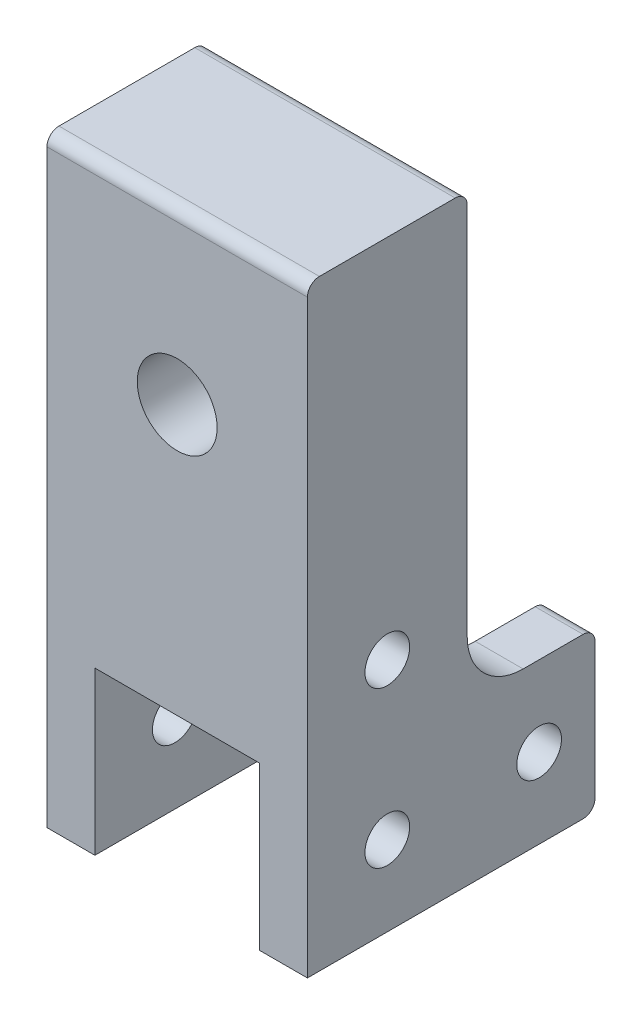
ISO-10303-21;
HEADER;
FILE_DESCRIPTION(('STEP AP214'),'2;1');
FILE_NAME('part.step','',(''),(''),'','','');
FILE_SCHEMA(('AUTOMOTIVE_DESIGN { 1 0 10303 214 1 1 1 1 }'));
ENDSEC;
DATA;
#1=APPLICATION_CONTEXT('core data for automotive mechanical design processes');
#2=APPLICATION_PROTOCOL_DEFINITION('international standard','automotive_design',2000,#1);
#3=PRODUCT_CONTEXT('',#1,'mechanical');
#4=PRODUCT('Part','Part','',(#3));
#5=PRODUCT_RELATED_PRODUCT_CATEGORY('part','',(#4));
#6=PRODUCT_DEFINITION_FORMATION('','',#4);
#7=PRODUCT_DEFINITION_CONTEXT('part definition',#1,'design');
#8=PRODUCT_DEFINITION('design','',#6,#7);
#9=PRODUCT_DEFINITION_SHAPE('','',#8);
#10=(LENGTH_UNIT() NAMED_UNIT(*) SI_UNIT(.MILLI.,.METRE.));
#11=(NAMED_UNIT(*) PLANE_ANGLE_UNIT() SI_UNIT($,.RADIAN.));
#12=(NAMED_UNIT(*) SI_UNIT($,.STERADIAN.) SOLID_ANGLE_UNIT());
#13=UNCERTAINTY_MEASURE_WITH_UNIT(LENGTH_MEASURE(1.E-05),#10,'distance_accuracy_value','');
#14=(GEOMETRIC_REPRESENTATION_CONTEXT(3) GLOBAL_UNCERTAINTY_ASSIGNED_CONTEXT((#13)) GLOBAL_UNIT_ASSIGNED_CONTEXT((#10,
#11,#12)) REPRESENTATION_CONTEXT('',''));
#15=CARTESIAN_POINT('',(0.,0.,0.));
#16=DIRECTION('',(0.,0.,1.));
#17=DIRECTION('',(1.,0.,0.));
#18=AXIS2_PLACEMENT_3D('',#15,#16,#17);
#19=CARTESIAN_POINT('',(-10.3,65.3,10.));
#20=DIRECTION('',(0.,0.,1.));
#21=DIRECTION('',(0.,-1.,0.));
#22=AXIS2_PLACEMENT_3D('',#19,#20,#21);
#23=PLANE('',#22);
#24=DIRECTION('',(1.,0.,0.));
#25=VECTOR('',#24,1.);
#26=CARTESIAN_POINT('',(-10.3,10.3,10.));
#27=LINE('',#26,#25);
#28=CARTESIAN_POINT('',(-10.3,10.3,10.));
#29=VERTEX_POINT('',#28);
#30=CARTESIAN_POINT('',(10.3,10.3,10.));
#31=VERTEX_POINT('',#30);
#32=EDGE_CURVE('E290',#29,#31,#27,.T.);
#33=ORIENTED_EDGE('',*,*,#32,.T.);
#34=DIRECTION('',(0.,-1.,0.));
#35=VECTOR('',#34,1.);
#36=CARTESIAN_POINT('',(10.3,17.,10.));
#37=LINE('',#36,#35);
#38=CARTESIAN_POINT('',(10.3,-10.,10.));
#39=VERTEX_POINT('',#38);
#40=EDGE_CURVE('E424',#31,#39,#37,.T.);
#41=ORIENTED_EDGE('',*,*,#40,.T.);
#42=DIRECTION('',(-1.,0.,0.));
#43=VECTOR('',#42,1.);
#44=CARTESIAN_POINT('',(-16.3,-10.,10.));
#45=LINE('',#44,#43);
#46=CARTESIAN_POINT('',(16.3,-10.,9.99999999999999));
#47=VERTEX_POINT('',#46);
#48=EDGE_CURVE('E193',#47,#39,#45,.T.);
#49=ORIENTED_EDGE('',*,*,#48,.F.);
#50=DIRECTION('',(0.,-1.,0.));
#51=VECTOR('',#50,1.);
#52=CARTESIAN_POINT('',(16.3,65.3,10.));
#53=LINE('',#52,#51);
#54=CARTESIAN_POINT('',(16.3,63.8,10.));
#55=VERTEX_POINT('',#54);
#56=EDGE_CURVE('E55',#55,#47,#53,.T.);
#57=ORIENTED_EDGE('',*,*,#56,.F.);
#58=DIRECTION('',(1.,0.,0.));
#59=VECTOR('',#58,1.);
#60=CARTESIAN_POINT('',(-10.3,63.8,10.));
#61=LINE('',#60,#59);
#62=CARTESIAN_POINT('',(-16.3,63.8,10.));
#63=VERTEX_POINT('',#62);
#64=EDGE_CURVE('E48',#55,#63,#61,.F.);
#65=ORIENTED_EDGE('',*,*,#64,.T.);
#66=DIRECTION('',(0.,-1.,0.));
#67=VECTOR('',#66,1.);
#68=CARTESIAN_POINT('',(-16.3,65.3,10.));
#69=LINE('',#68,#67);
#70=CARTESIAN_POINT('',(-16.3,-10.,10.));
#71=VERTEX_POINT('',#70);
#72=EDGE_CURVE('E178',#63,#71,#69,.T.);
#73=ORIENTED_EDGE('',*,*,#72,.T.);
#74=CARTESIAN_POINT('',(-10.3,-10.,10.));
#75=VERTEX_POINT('',#74);
#76=EDGE_CURVE('E181',#75,#71,#45,.T.);
#77=ORIENTED_EDGE('',*,*,#76,.F.);
#78=DIRECTION('',(0.,1.,0.));
#79=VECTOR('',#78,1.);
#80=CARTESIAN_POINT('',(-10.3,17.,10.));
#81=LINE('',#80,#79);
#82=EDGE_CURVE('E421',#75,#29,#81,.T.);
#83=ORIENTED_EDGE('',*,*,#82,.T.);
#84=EDGE_LOOP('',(#33,#41,#49,#57,#65,#73,#77,#83));
#85=FACE_BOUND('',#84,.T.);
#86=CARTESIAN_POINT('',(0.,44.,10.));
#87=DIRECTION('',(0.,0.,1.));
#88=DIRECTION('',(1.,0.,0.));
#89=AXIS2_PLACEMENT_3D('',#86,#87,#88);
#90=CIRCLE('',#89,5.);
#91=CARTESIAN_POINT('',(5.,44.,10.));
#92=VERTEX_POINT('',#91);
#93=EDGE_CURVE('E302',#92,#92,#90,.T.);
#94=ORIENTED_EDGE('',*,*,#93,.F.);
#95=EDGE_LOOP('',(#94));
#96=FACE_BOUND('',#95,.T.);
#97=ADVANCED_FACE('F39',(#85,#96),#23,.T.);
#98=CARTESIAN_POINT('',(-10.3,65.3,-9.99999999999998));
#99=DIRECTION('',(0.,1.,0.));
#100=DIRECTION('',(0.,0.,1.));
#101=AXIS2_PLACEMENT_3D('',#98,#99,#100);
#102=PLANE('',#101);
#103=DIRECTION('',(0.,0.,1.));
#104=VECTOR('',#103,1.);
#105=CARTESIAN_POINT('',(-16.3,65.3,10.));
#106=LINE('',#105,#104);
#107=CARTESIAN_POINT('',(-16.3,65.3,-8.49999999999998));
#108=VERTEX_POINT('',#107);
#109=CARTESIAN_POINT('',(-16.3,65.3,8.50000000000002));
#110=VERTEX_POINT('',#109);
#111=EDGE_CURVE('E187',#108,#110,#106,.T.);
#112=ORIENTED_EDGE('',*,*,#111,.T.);
#113=DIRECTION('',(1.,0.,0.));
#114=VECTOR('',#113,1.);
#115=CARTESIAN_POINT('',(-10.3,65.3,8.50000000000002));
#116=LINE('',#115,#114);
#117=CARTESIAN_POINT('',(16.3,65.3,8.50000000000002));
#118=VERTEX_POINT('',#117);
#119=EDGE_CURVE('E369',#110,#118,#116,.T.);
#120=ORIENTED_EDGE('',*,*,#119,.T.);
#121=DIRECTION('',(0.,0.,1.));
#122=VECTOR('',#121,1.);
#123=CARTESIAN_POINT('',(16.3,65.3,10.));
#124=LINE('',#123,#122);
#125=CARTESIAN_POINT('',(16.3,65.3,-8.49999999999998));
#126=VERTEX_POINT('',#125);
#127=EDGE_CURVE('E249',#126,#118,#124,.T.);
#128=ORIENTED_EDGE('',*,*,#127,.F.);
#129=DIRECTION('',(1.,0.,0.));
#130=VECTOR('',#129,1.);
#131=CARTESIAN_POINT('',(-10.3,65.3,-8.49999999999998));
#132=LINE('',#131,#130);
#133=EDGE_CURVE('E366',#126,#108,#132,.F.);
#134=ORIENTED_EDGE('',*,*,#133,.T.);
#135=EDGE_LOOP('',(#112,#120,#128,#134));
#136=FACE_BOUND('',#135,.T.);
#137=ADVANCED_FACE('F377',(#136),#102,.T.);
#138=CARTESIAN_POINT('',(-10.3,65.3,-9.99999999999998));
#139=DIRECTION('',(0.,0.,-1.));
#140=DIRECTION('',(0.,1.,0.));
#141=AXIS2_PLACEMENT_3D('',#138,#139,#140);
#142=PLANE('',#141);
#143=CARTESIAN_POINT('',(0.,44.,-9.99999999999998));
#144=DIRECTION('',(0.,0.,-1.));
#145=DIRECTION('',(0.,1.,0.));
#146=AXIS2_PLACEMENT_3D('',#143,#144,#145);
#147=CIRCLE('',#146,5.);
#148=CARTESIAN_POINT('',(0.,49.,-9.99999999999998));
#149=VERTEX_POINT('',#148);
#150=EDGE_CURVE('E297',#149,#149,#147,.T.);
#151=ORIENTED_EDGE('',*,*,#150,.F.);
#152=EDGE_LOOP('',(#151));
#153=FACE_BOUND('',#152,.T.);
#154=DIRECTION('',(0.,1.,0.));
#155=VECTOR('',#154,1.);
#156=CARTESIAN_POINT('',(-16.3,65.3,-9.99999999999999));
#157=LINE('',#156,#155);
#158=CARTESIAN_POINT('',(-16.3,17.,-10.));
#159=VERTEX_POINT('',#158);
#160=CARTESIAN_POINT('',(-16.3,63.8,-9.99999999999999));
#161=VERTEX_POINT('',#160);
#162=EDGE_CURVE('E390',#159,#161,#157,.T.);
#163=ORIENTED_EDGE('',*,*,#162,.T.);
#164=DIRECTION('',(1.,0.,0.));
#165=VECTOR('',#164,1.);
#166=CARTESIAN_POINT('',(-10.3,63.8,-9.99999999999998));
#167=LINE('',#166,#165);
#168=CARTESIAN_POINT('',(16.3,63.8,-9.99999999999999));
#169=VERTEX_POINT('',#168);
#170=EDGE_CURVE('E11',#161,#169,#167,.T.);
#171=ORIENTED_EDGE('',*,*,#170,.T.);
#172=DIRECTION('',(0.,1.,0.));
#173=VECTOR('',#172,1.);
#174=CARTESIAN_POINT('',(16.3,65.3,-9.99999999999999));
#175=LINE('',#174,#173);
#176=CARTESIAN_POINT('',(16.3,17.,-10.));
#177=VERTEX_POINT('',#176);
#178=EDGE_CURVE('E245',#177,#169,#175,.T.);
#179=ORIENTED_EDGE('',*,*,#178,.F.);
#180=DIRECTION('',(-1.,0.,0.));
#181=VECTOR('',#180,1.);
#182=CARTESIAN_POINT('',(16.3,17.,-10.));
#183=LINE('',#182,#181);
#184=CARTESIAN_POINT('',(10.3,17.,-9.99999999999999));
#185=VERTEX_POINT('',#184);
#186=EDGE_CURVE('E255',#177,#185,#183,.T.);
#187=ORIENTED_EDGE('',*,*,#186,.T.);
#188=DIRECTION('',(0.,1.,0.));
#189=VECTOR('',#188,1.);
#190=CARTESIAN_POINT('',(10.3,65.3,-9.99999999999998));
#191=LINE('',#190,#189);
#192=CARTESIAN_POINT('',(10.3,10.3,-9.99999999999999));
#193=VERTEX_POINT('',#192);
#194=EDGE_CURVE('E279',#193,#185,#191,.T.);
#195=ORIENTED_EDGE('',*,*,#194,.F.);
#196=DIRECTION('',(1.,0.,0.));
#197=VECTOR('',#196,1.);
#198=CARTESIAN_POINT('',(-10.3,10.3,-9.99999999999999));
#199=LINE('',#198,#197);
#200=CARTESIAN_POINT('',(-10.3,10.3,-9.99999999999999));
#201=VERTEX_POINT('',#200);
#202=EDGE_CURVE('E291',#201,#193,#199,.T.);
#203=ORIENTED_EDGE('',*,*,#202,.F.);
#204=DIRECTION('',(0.,1.,0.));
#205=VECTOR('',#204,1.);
#206=CARTESIAN_POINT('',(-10.3,65.3,-9.99999999999998));
#207=LINE('',#206,#205);
#208=CARTESIAN_POINT('',(-10.3,17.,-10.));
#209=VERTEX_POINT('',#208);
#210=EDGE_CURVE('E286',#201,#209,#207,.T.);
#211=ORIENTED_EDGE('',*,*,#210,.T.);
#212=DIRECTION('',(1.,0.,0.));
#213=VECTOR('',#212,1.);
#214=CARTESIAN_POINT('',(-16.3,17.,-10.));
#215=LINE('',#214,#213);
#216=EDGE_CURVE('E207',#159,#209,#215,.T.);
#217=ORIENTED_EDGE('',*,*,#216,.F.);
#218=EDGE_LOOP('',(#163,#171,#179,#187,#195,#203,#211,#217));
#219=FACE_BOUND('',#218,.T.);
#220=ADVANCED_FACE('F388',(#153,#219),#142,.T.);
#221=CARTESIAN_POINT('',(-10.3,10.3,-9.99999999999999));
#222=DIRECTION('',(0.,-1.,0.));
#223=DIRECTION('',(0.,0.,-1.));
#224=AXIS2_PLACEMENT_3D('',#221,#222,#223);
#225=PLANE('',#224);
#226=ORIENTED_EDGE('',*,*,#202,.T.);
#227=DIRECTION('',(0.,0.,-1.));
#228=VECTOR('',#227,1.);
#229=CARTESIAN_POINT('',(10.3,10.3,-9.99999999999999));
#230=LINE('',#229,#228);
#231=EDGE_CURVE('E275',#31,#193,#230,.T.);
#232=ORIENTED_EDGE('',*,*,#231,.F.);
#233=ORIENTED_EDGE('',*,*,#32,.F.);
#234=DIRECTION('',(0.,0.,-1.));
#235=VECTOR('',#234,1.);
#236=CARTESIAN_POINT('',(-10.3,10.3,-9.99999999999999));
#237=LINE('',#236,#235);
#238=EDGE_CURVE('E282',#29,#201,#237,.T.);
#239=ORIENTED_EDGE('',*,*,#238,.T.);
#240=EDGE_LOOP('',(#226,#232,#233,#239));
#241=FACE_BOUND('',#240,.T.);
#242=ADVANCED_FACE('F420',(#241),#225,.T.);
#243=CARTESIAN_POINT('',(10.3,17.,-17.));
#244=DIRECTION('',(-1.,0.,0.));
#245=DIRECTION('',(0.,0.,1.));
#246=AXIS2_PLACEMENT_3D('',#243,#244,#245);
#247=PLANE('',#246);
#248=ORIENTED_EDGE('',*,*,#40,.F.);
#249=ORIENTED_EDGE('',*,*,#231,.T.);
#250=ORIENTED_EDGE('',*,*,#194,.T.);
#251=CARTESIAN_POINT('',(10.3,17.,-17.));
#252=DIRECTION('',(-1.,0.,0.));
#253=DIRECTION('',(0.,0.,1.));
#254=AXIS2_PLACEMENT_3D('',#251,#252,#253);
#255=CIRCLE('',#254,7.);
#256=CARTESIAN_POINT('',(10.3,10.,-17.0000000000001));
#257=VERTEX_POINT('',#256);
#258=EDGE_CURVE('E235',#257,#185,#255,.T.);
#259=ORIENTED_EDGE('',*,*,#258,.F.);
#260=DIRECTION('',(0.,0.,1.));
#261=VECTOR('',#260,1.);
#262=CARTESIAN_POINT('',(10.3,10.,-26.));
#263=LINE('',#262,#261);
#264=CARTESIAN_POINT('',(10.3,10.,-24.5));
#265=VERTEX_POINT('',#264);
#266=EDGE_CURVE('E262',#265,#257,#263,.T.);
#267=ORIENTED_EDGE('',*,*,#266,.F.);
#268=CARTESIAN_POINT('',(10.3,8.5,-24.5));
#269=DIRECTION('',(-1.,0.,0.));
#270=DIRECTION('',(0.,0.,1.));
#271=AXIS2_PLACEMENT_3D('',#268,#269,#270);
#272=CIRCLE('',#271,1.5);
#273=CARTESIAN_POINT('',(10.3,8.5,-26.));
#274=VERTEX_POINT('',#273);
#275=EDGE_CURVE('E306',#265,#274,#272,.T.);
#276=ORIENTED_EDGE('',*,*,#275,.T.);
#277=DIRECTION('',(0.,1.,0.));
#278=VECTOR('',#277,1.);
#279=CARTESIAN_POINT('',(10.3,10.,-26.));
#280=LINE('',#279,#278);
#281=CARTESIAN_POINT('',(10.3,-8.5,-26.));
#282=VERTEX_POINT('',#281);
#283=EDGE_CURVE('E258',#282,#274,#280,.T.);
#284=ORIENTED_EDGE('',*,*,#283,.F.);
#285=CARTESIAN_POINT('',(10.3,-8.5,-24.5));
#286=DIRECTION('',(-1.,0.,0.));
#287=DIRECTION('',(0.,0.,1.));
#288=AXIS2_PLACEMENT_3D('',#285,#286,#287);
#289=CIRCLE('',#288,1.5);
#290=CARTESIAN_POINT('',(10.3,-10.,-24.5));
#291=VERTEX_POINT('',#290);
#292=EDGE_CURVE('E309',#282,#291,#289,.T.);
#293=ORIENTED_EDGE('',*,*,#292,.T.);
#294=DIRECTION('',(0.,0.,-1.));
#295=VECTOR('',#294,1.);
#296=CARTESIAN_POINT('',(10.3,-10.,-26.));
#297=LINE('',#296,#295);
#298=EDGE_CURVE('E230',#39,#291,#297,.T.);
#299=ORIENTED_EDGE('',*,*,#298,.F.);
#300=EDGE_LOOP('',(#248,#249,#250,#259,#267,#276,#284,#293,#299));
#301=FACE_BOUND('',#300,.T.);
#302=CARTESIAN_POINT('',(10.3,0.,-19.));
#303=DIRECTION('',(-1.,0.,0.));
#304=DIRECTION('',(0.,0.,1.));
#305=AXIS2_PLACEMENT_3D('',#302,#303,#304);
#306=CIRCLE('',#305,2.8);
#307=CARTESIAN_POINT('',(10.3,0.,-16.2));
#308=VERTEX_POINT('',#307);
#309=EDGE_CURVE('E219',#308,#308,#306,.T.);
#310=ORIENTED_EDGE('',*,*,#309,.F.);
#311=EDGE_LOOP('',(#310));
#312=FACE_BOUND('',#311,.T.);
#313=CARTESIAN_POINT('',(10.3,0.,0.));
#314=DIRECTION('',(-1.,0.,0.));
#315=DIRECTION('',(0.,0.,1.));
#316=AXIS2_PLACEMENT_3D('',#313,#314,#315);
#317=CIRCLE('',#316,2.8);
#318=CARTESIAN_POINT('',(10.3,0.,2.8));
#319=VERTEX_POINT('',#318);
#320=EDGE_CURVE('E461',#319,#319,#317,.T.);
#321=ORIENTED_EDGE('',*,*,#320,.F.);
#322=EDGE_LOOP('',(#321));
#323=FACE_BOUND('',#322,.T.);
#324=ADVANCED_FACE('F476',(#301,#312,#323),#247,.T.);
#325=CARTESIAN_POINT('',(16.3,-10.,-26.));
#326=DIRECTION('',(0.,1.,0.));
#327=DIRECTION('',(0.,0.,1.));
#328=AXIS2_PLACEMENT_3D('',#325,#326,#327);
#329=PLANE('',#328);
#330=DIRECTION('',(0.,0.,-1.));
#331=VECTOR('',#330,1.);
#332=CARTESIAN_POINT('',(16.3,-10.,-26.));
#333=LINE('',#332,#331);
#334=CARTESIAN_POINT('',(16.3,-10.,-24.5));
#335=VERTEX_POINT('',#334);
#336=EDGE_CURVE('E231',#47,#335,#333,.T.);
#337=ORIENTED_EDGE('',*,*,#336,.F.);
#338=ORIENTED_EDGE('',*,*,#48,.T.);
#339=ORIENTED_EDGE('',*,*,#298,.T.);
#340=DIRECTION('',(-1.,0.,0.));
#341=VECTOR('',#340,1.);
#342=CARTESIAN_POINT('',(16.3,-10.,-24.5));
#343=LINE('',#342,#341);
#344=EDGE_CURVE('E294',#291,#335,#343,.F.);
#345=ORIENTED_EDGE('',*,*,#344,.T.);
#346=EDGE_LOOP('',(#337,#338,#339,#345));
#347=FACE_BOUND('',#346,.T.);
#348=ADVANCED_FACE('F479',(#347),#329,.F.);
#349=CARTESIAN_POINT('',(16.3,10.,-26.));
#350=DIRECTION('',(0.,0.,1.));
#351=DIRECTION('',(1.,0.,0.));
#352=AXIS2_PLACEMENT_3D('',#349,#350,#351);
#353=PLANE('',#352);
#354=DIRECTION('',(0.,1.,0.));
#355=VECTOR('',#354,1.);
#356=CARTESIAN_POINT('',(16.3,10.,-26.));
#357=LINE('',#356,#355);
#358=CARTESIAN_POINT('',(16.3,-8.5,-26.));
#359=VERTEX_POINT('',#358);
#360=CARTESIAN_POINT('',(16.3,8.5,-26.));
#361=VERTEX_POINT('',#360);
#362=EDGE_CURVE('E234',#359,#361,#357,.T.);
#363=ORIENTED_EDGE('',*,*,#362,.F.);
#364=DIRECTION('',(-1.,0.,0.));
#365=VECTOR('',#364,1.);
#366=CARTESIAN_POINT('',(16.3,-8.5,-26.));
#367=LINE('',#366,#365);
#368=EDGE_CURVE('E355',#359,#282,#367,.T.);
#369=ORIENTED_EDGE('',*,*,#368,.T.);
#370=ORIENTED_EDGE('',*,*,#283,.T.);
#371=DIRECTION('',(-1.,0.,0.));
#372=VECTOR('',#371,1.);
#373=CARTESIAN_POINT('',(16.3,8.5,-26.));
#374=LINE('',#373,#372);
#375=EDGE_CURVE('E352',#274,#361,#374,.F.);
#376=ORIENTED_EDGE('',*,*,#375,.T.);
#377=EDGE_LOOP('',(#363,#369,#370,#376));
#378=FACE_BOUND('',#377,.T.);
#379=ADVANCED_FACE('F572',(#378),#353,.F.);
#380=CARTESIAN_POINT('',(16.3,10.,-26.));
#381=DIRECTION('',(0.,-1.,0.));
#382=DIRECTION('',(0.,0.,-1.));
#383=AXIS2_PLACEMENT_3D('',#380,#381,#382);
#384=PLANE('',#383);
#385=DIRECTION('',(0.,0.,1.));
#386=VECTOR('',#385,1.);
#387=CARTESIAN_POINT('',(16.3,10.,-26.));
#388=LINE('',#387,#386);
#389=CARTESIAN_POINT('',(16.3,10.,-24.5));
#390=VERTEX_POINT('',#389);
#391=CARTESIAN_POINT('',(16.3,10.,-17.0000000000001));
#392=VERTEX_POINT('',#391);
#393=EDGE_CURVE('E239',#390,#392,#388,.T.);
#394=ORIENTED_EDGE('',*,*,#393,.F.);
#395=DIRECTION('',(-1.,0.,0.));
#396=VECTOR('',#395,1.);
#397=CARTESIAN_POINT('',(16.3,10.,-24.5));
#398=LINE('',#397,#396);
#399=EDGE_CURVE('E359',#390,#265,#398,.T.);
#400=ORIENTED_EDGE('',*,*,#399,.T.);
#401=ORIENTED_EDGE('',*,*,#266,.T.);
#402=DIRECTION('',(-1.,0.,0.));
#403=VECTOR('',#402,1.);
#404=CARTESIAN_POINT('',(16.3,10.,-17.0000000000001));
#405=LINE('',#404,#403);
#406=EDGE_CURVE('E271',#392,#257,#405,.T.);
#407=ORIENTED_EDGE('',*,*,#406,.F.);
#408=EDGE_LOOP('',(#394,#400,#401,#407));
#409=FACE_BOUND('',#408,.T.);
#410=ADVANCED_FACE('F501',(#409),#384,.F.);
#411=CARTESIAN_POINT('',(16.3,17.,-17.));
#412=DIRECTION('',(-1.,0.,0.));
#413=DIRECTION('',(0.,0.,1.));
#414=AXIS2_PLACEMENT_3D('',#411,#412,#413);
#415=CYLINDRICAL_SURFACE('',#414,7.);
#416=ORIENTED_EDGE('',*,*,#258,.T.);
#417=ORIENTED_EDGE('',*,*,#186,.F.);
#418=CARTESIAN_POINT('',(16.3,17.,-17.));
#419=DIRECTION('',(-1.,0.,0.));
#420=DIRECTION('',(0.,0.,1.));
#421=AXIS2_PLACEMENT_3D('',#418,#419,#420);
#422=CIRCLE('',#421,7.);
#423=EDGE_CURVE('E242',#392,#177,#422,.T.);
#424=ORIENTED_EDGE('',*,*,#423,.F.);
#425=ORIENTED_EDGE('',*,*,#406,.T.);
#426=EDGE_LOOP('',(#416,#417,#424,#425));
#427=FACE_BOUND('',#426,.T.);
#428=ADVANCED_FACE('F493',(#427),#415,.F.);
#429=CARTESIAN_POINT('',(16.3,17.,-17.));
#430=DIRECTION('',(-1.,0.,0.));
#431=DIRECTION('',(0.,0.,1.));
#432=AXIS2_PLACEMENT_3D('',#429,#430,#431);
#433=PLANE('',#432);
#434=CARTESIAN_POINT('',(16.3,19.5,0.));
#435=DIRECTION('',(1.,0.,0.));
#436=DIRECTION('',(0.,0.,-1.));
#437=AXIS2_PLACEMENT_3D('',#434,#435,#436);
#438=CIRCLE('',#437,2.8);
#439=CARTESIAN_POINT('',(16.3,19.5,-2.8));
#440=VERTEX_POINT('',#439);
#441=EDGE_CURVE('E301',#440,#440,#438,.T.);
#442=ORIENTED_EDGE('',*,*,#441,.F.);
#443=EDGE_LOOP('',(#442));
#444=FACE_BOUND('',#443,.T.);
#445=CARTESIAN_POINT('',(16.3,0.,-19.));
#446=DIRECTION('',(1.,0.,0.));
#447=DIRECTION('',(0.,0.,-1.));
#448=AXIS2_PLACEMENT_3D('',#445,#446,#447);
#449=CIRCLE('',#448,2.8);
#450=CARTESIAN_POINT('',(16.3,0.,-21.8));
#451=VERTEX_POINT('',#450);
#452=EDGE_CURVE('E439',#451,#451,#449,.T.);
#453=ORIENTED_EDGE('',*,*,#452,.F.);
#454=EDGE_LOOP('',(#453));
#455=FACE_BOUND('',#454,.T.);
#456=CARTESIAN_POINT('',(16.3,0.,0.));
#457=DIRECTION('',(1.,0.,0.));
#458=DIRECTION('',(0.,0.,-1.));
#459=AXIS2_PLACEMENT_3D('',#456,#457,#458);
#460=CIRCLE('',#459,2.8);
#461=CARTESIAN_POINT('',(16.3,0.,-2.8));
#462=VERTEX_POINT('',#461);
#463=EDGE_CURVE('E438',#462,#462,#460,.T.);
#464=ORIENTED_EDGE('',*,*,#463,.F.);
#465=EDGE_LOOP('',(#464));
#466=FACE_BOUND('',#465,.T.);
#467=ORIENTED_EDGE('',*,*,#56,.T.);
#468=ORIENTED_EDGE('',*,*,#336,.T.);
#469=CARTESIAN_POINT('',(16.3,-8.5,-24.5));
#470=DIRECTION('',(-1.,0.,0.));
#471=DIRECTION('',(0.,0.,1.));
#472=AXIS2_PLACEMENT_3D('',#469,#470,#471);
#473=CIRCLE('',#472,1.5);
#474=EDGE_CURVE('E322',#335,#359,#473,.F.);
#475=ORIENTED_EDGE('',*,*,#474,.T.);
#476=ORIENTED_EDGE('',*,*,#362,.T.);
#477=CARTESIAN_POINT('',(16.3,8.5,-24.5));
#478=DIRECTION('',(-1.,0.,0.));
#479=DIRECTION('',(0.,0.,1.));
#480=AXIS2_PLACEMENT_3D('',#477,#478,#479);
#481=CIRCLE('',#480,1.5);
#482=EDGE_CURVE('E319',#361,#390,#481,.F.);
#483=ORIENTED_EDGE('',*,*,#482,.T.);
#484=ORIENTED_EDGE('',*,*,#393,.T.);
#485=ORIENTED_EDGE('',*,*,#423,.T.);
#486=ORIENTED_EDGE('',*,*,#178,.T.);
#487=CARTESIAN_POINT('',(16.3,63.8,-8.49999999999998));
#488=DIRECTION('',(-1.,0.,0.));
#489=DIRECTION('',(0.,0.,1.));
#490=AXIS2_PLACEMENT_3D('',#487,#488,#489);
#491=CIRCLE('',#490,1.5);
#492=EDGE_CURVE('E313',#169,#126,#491,.F.);
#493=ORIENTED_EDGE('',*,*,#492,.T.);
#494=ORIENTED_EDGE('',*,*,#127,.T.);
#495=CARTESIAN_POINT('',(16.3,63.8,8.50000000000002));
#496=DIRECTION('',(-1.,0.,0.));
#497=DIRECTION('',(0.,0.,1.));
#498=AXIS2_PLACEMENT_3D('',#495,#496,#497);
#499=CIRCLE('',#498,1.5);
#500=EDGE_CURVE('E316',#118,#55,#499,.F.);
#501=ORIENTED_EDGE('',*,*,#500,.T.);
#502=EDGE_LOOP('',(#467,#468,#475,#476,#483,#484,#485,#486,#493,#494,#501));
#503=FACE_BOUND('',#502,.T.);
#504=ADVANCED_FACE('F381',(#444,#455,#466,#503),#433,.F.);
#505=CARTESIAN_POINT('',(-10.3,17.,-17.));
#506=DIRECTION('',(1.,0.,0.));
#507=DIRECTION('',(0.,0.,1.));
#508=AXIS2_PLACEMENT_3D('',#505,#506,#507);
#509=PLANE('',#508);
#510=ORIENTED_EDGE('',*,*,#82,.F.);
#511=DIRECTION('',(0.,0.,-1.));
#512=VECTOR('',#511,1.);
#513=CARTESIAN_POINT('',(-10.3,-10.,-26.));
#514=LINE('',#513,#512);
#515=CARTESIAN_POINT('',(-10.3,-10.,-24.5));
#516=VERTEX_POINT('',#515);
#517=EDGE_CURVE('E188',#75,#516,#514,.T.);
#518=ORIENTED_EDGE('',*,*,#517,.T.);
#519=CARTESIAN_POINT('',(-10.3,-8.5,-24.5));
#520=DIRECTION('',(1.,0.,0.));
#521=DIRECTION('',(0.,0.,-1.));
#522=AXIS2_PLACEMENT_3D('',#519,#520,#521);
#523=CIRCLE('',#522,1.5);
#524=CARTESIAN_POINT('',(-10.3,-8.5,-26.));
#525=VERTEX_POINT('',#524);
#526=EDGE_CURVE('E328',#516,#525,#523,.T.);
#527=ORIENTED_EDGE('',*,*,#526,.T.);
#528=DIRECTION('',(0.,1.,0.));
#529=VECTOR('',#528,1.);
#530=CARTESIAN_POINT('',(-10.3,10.,-26.));
#531=LINE('',#530,#529);
#532=CARTESIAN_POINT('',(-10.3,8.5,-26.));
#533=VERTEX_POINT('',#532);
#534=EDGE_CURVE('E222',#525,#533,#531,.T.);
#535=ORIENTED_EDGE('',*,*,#534,.T.);
#536=CARTESIAN_POINT('',(-10.3,8.5,-24.5));
#537=DIRECTION('',(1.,0.,0.));
#538=DIRECTION('',(0.,0.,-1.));
#539=AXIS2_PLACEMENT_3D('',#536,#537,#538);
#540=CIRCLE('',#539,1.5);
#541=CARTESIAN_POINT('',(-10.3,10.,-24.5));
#542=VERTEX_POINT('',#541);
#543=EDGE_CURVE('E325',#533,#542,#540,.T.);
#544=ORIENTED_EDGE('',*,*,#543,.T.);
#545=DIRECTION('',(0.,0.,1.));
#546=VECTOR('',#545,1.);
#547=CARTESIAN_POINT('',(-10.3,10.,-26.));
#548=LINE('',#547,#546);
#549=CARTESIAN_POINT('',(-10.3,10.,-17.0000000000001));
#550=VERTEX_POINT('',#549);
#551=EDGE_CURVE('E218',#542,#550,#548,.T.);
#552=ORIENTED_EDGE('',*,*,#551,.T.);
#553=CARTESIAN_POINT('',(-10.3,17.,-17.));
#554=DIRECTION('',(-1.,0.,0.));
#555=DIRECTION('',(0.,0.,1.));
#556=AXIS2_PLACEMENT_3D('',#553,#554,#555);
#557=CIRCLE('',#556,7.);
#558=EDGE_CURVE('E214',#550,#209,#557,.T.);
#559=ORIENTED_EDGE('',*,*,#558,.T.);
#560=ORIENTED_EDGE('',*,*,#210,.F.);
#561=ORIENTED_EDGE('',*,*,#238,.F.);
#562=EDGE_LOOP('',(#510,#518,#527,#535,#544,#552,#559,#560,#561));
#563=FACE_BOUND('',#562,.T.);
#564=CARTESIAN_POINT('',(-10.3,0.,-19.));
#565=DIRECTION('',(1.,0.,0.));
#566=DIRECTION('',(0.,0.,-1.));
#567=AXIS2_PLACEMENT_3D('',#564,#565,#566);
#568=CIRCLE('',#567,2.8);
#569=CARTESIAN_POINT('',(-10.3,0.,-21.8));
#570=VERTEX_POINT('',#569);
#571=EDGE_CURVE('E465',#570,#570,#568,.T.);
#572=ORIENTED_EDGE('',*,*,#571,.F.);
#573=EDGE_LOOP('',(#572));
#574=FACE_BOUND('',#573,.T.);
#575=CARTESIAN_POINT('',(-10.3,0.,0.));
#576=DIRECTION('',(1.,0.,0.));
#577=DIRECTION('',(0.,0.,-1.));
#578=AXIS2_PLACEMENT_3D('',#575,#576,#577);
#579=CIRCLE('',#578,2.8);
#580=CARTESIAN_POINT('',(-10.3,0.,-2.8));
#581=VERTEX_POINT('',#580);
#582=EDGE_CURVE('E454',#581,#581,#579,.T.);
#583=ORIENTED_EDGE('',*,*,#582,.F.);
#584=EDGE_LOOP('',(#583));
#585=FACE_BOUND('',#584,.T.);
#586=ADVANCED_FACE('F412',(#563,#574,#585),#509,.T.);
#587=CARTESIAN_POINT('',(-16.3,17.,-17.));
#588=DIRECTION('',(1.,0.,0.));
#589=DIRECTION('',(0.,0.,-1.));
#590=AXIS2_PLACEMENT_3D('',#587,#588,#589);
#591=CYLINDRICAL_SURFACE('',#590,7.);
#592=ORIENTED_EDGE('',*,*,#558,.F.);
#593=DIRECTION('',(1.,0.,0.));
#594=VECTOR('',#593,1.);
#595=CARTESIAN_POINT('',(-16.3,10.,-17.0000000000001));
#596=LINE('',#595,#594);
#597=CARTESIAN_POINT('',(-16.3,10.,-17.0000000000001));
#598=VERTEX_POINT('',#597);
#599=EDGE_CURVE('E201',#598,#550,#596,.T.);
#600=ORIENTED_EDGE('',*,*,#599,.F.);
#601=CARTESIAN_POINT('',(-16.3,17.,-17.));
#602=DIRECTION('',(-1.,0.,0.));
#603=DIRECTION('',(0.,0.,1.));
#604=AXIS2_PLACEMENT_3D('',#601,#602,#603);
#605=CIRCLE('',#604,7.);
#606=EDGE_CURVE('E394',#598,#159,#605,.T.);
#607=ORIENTED_EDGE('',*,*,#606,.T.);
#608=ORIENTED_EDGE('',*,*,#216,.T.);
#609=EDGE_LOOP('',(#592,#600,#607,#608));
#610=FACE_BOUND('',#609,.T.);
#611=ADVANCED_FACE('F410',(#610),#591,.F.);
#612=CARTESIAN_POINT('',(-16.3,10.,-26.));
#613=DIRECTION('',(0.,1.,0.));
#614=DIRECTION('',(0.,0.,1.));
#615=AXIS2_PLACEMENT_3D('',#612,#613,#614);
#616=PLANE('',#615);
#617=ORIENTED_EDGE('',*,*,#551,.F.);
#618=DIRECTION('',(1.,0.,0.));
#619=VECTOR('',#618,1.);
#620=CARTESIAN_POINT('',(-16.3,10.,-24.5));
#621=LINE('',#620,#619);
#622=CARTESIAN_POINT('',(-16.3,10.,-24.5));
#623=VERTEX_POINT('',#622);
#624=EDGE_CURVE('E363',#542,#623,#621,.F.);
#625=ORIENTED_EDGE('',*,*,#624,.T.);
#626=DIRECTION('',(0.,0.,1.));
#627=VECTOR('',#626,1.);
#628=CARTESIAN_POINT('',(-16.3,10.,-26.));
#629=LINE('',#628,#627);
#630=EDGE_CURVE('E210',#623,#598,#629,.T.);
#631=ORIENTED_EDGE('',*,*,#630,.T.);
#632=ORIENTED_EDGE('',*,*,#599,.T.);
#633=EDGE_LOOP('',(#617,#625,#631,#632));
#634=FACE_BOUND('',#633,.T.);
#635=ADVANCED_FACE('F405',(#634),#616,.T.);
#636=CARTESIAN_POINT('',(-16.3,10.,-26.));
#637=DIRECTION('',(0.,0.,-1.));
#638=DIRECTION('',(-1.,0.,0.));
#639=AXIS2_PLACEMENT_3D('',#636,#637,#638);
#640=PLANE('',#639);
#641=ORIENTED_EDGE('',*,*,#534,.F.);
#642=DIRECTION('',(1.,0.,0.));
#643=VECTOR('',#642,1.);
#644=CARTESIAN_POINT('',(-16.3,-8.5,-26.));
#645=LINE('',#644,#643);
#646=CARTESIAN_POINT('',(-16.3,-8.5,-26.));
#647=VERTEX_POINT('',#646);
#648=EDGE_CURVE('E349',#525,#647,#645,.F.);
#649=ORIENTED_EDGE('',*,*,#648,.T.);
#650=DIRECTION('',(0.,1.,0.));
#651=VECTOR('',#650,1.);
#652=CARTESIAN_POINT('',(-16.3,10.,-26.));
#653=LINE('',#652,#651);
#654=CARTESIAN_POINT('',(-16.3,8.5,-26.));
#655=VERTEX_POINT('',#654);
#656=EDGE_CURVE('E202',#647,#655,#653,.T.);
#657=ORIENTED_EDGE('',*,*,#656,.T.);
#658=DIRECTION('',(1.,0.,0.));
#659=VECTOR('',#658,1.);
#660=CARTESIAN_POINT('',(-16.3,8.5,-26.));
#661=LINE('',#660,#659);
#662=EDGE_CURVE('E345',#655,#533,#661,.T.);
#663=ORIENTED_EDGE('',*,*,#662,.T.);
#664=EDGE_LOOP('',(#641,#649,#657,#663));
#665=FACE_BOUND('',#664,.T.);
#666=ADVANCED_FACE('F599',(#665),#640,.T.);
#667=CARTESIAN_POINT('',(-16.3,-10.,-26.));
#668=DIRECTION('',(0.,-1.,0.));
#669=DIRECTION('',(0.,0.,-1.));
#670=AXIS2_PLACEMENT_3D('',#667,#668,#669);
#671=PLANE('',#670);
#672=ORIENTED_EDGE('',*,*,#76,.T.);
#673=DIRECTION('',(0.,0.,-1.));
#674=VECTOR('',#673,1.);
#675=CARTESIAN_POINT('',(-16.3,-10.,-26.));
#676=LINE('',#675,#674);
#677=CARTESIAN_POINT('',(-16.3,-10.,-24.5));
#678=VERTEX_POINT('',#677);
#679=EDGE_CURVE('E63',#71,#678,#676,.T.);
#680=ORIENTED_EDGE('',*,*,#679,.T.);
#681=DIRECTION('',(1.,0.,0.));
#682=VECTOR('',#681,1.);
#683=CARTESIAN_POINT('',(-16.3,-10.,-24.5));
#684=LINE('',#683,#682);
#685=EDGE_CURVE('E342',#678,#516,#684,.T.);
#686=ORIENTED_EDGE('',*,*,#685,.T.);
#687=ORIENTED_EDGE('',*,*,#517,.F.);
#688=EDGE_LOOP('',(#672,#680,#686,#687));
#689=FACE_BOUND('',#688,.T.);
#690=ADVANCED_FACE('F191',(#689),#671,.T.);
#691=CARTESIAN_POINT('',(-16.3,17.,-17.));
#692=DIRECTION('',(1.,0.,0.));
#693=DIRECTION('',(0.,0.,1.));
#694=AXIS2_PLACEMENT_3D('',#691,#692,#693);
#695=PLANE('',#694);
#696=CARTESIAN_POINT('',(-16.3,19.5,0.));
#697=DIRECTION('',(1.,0.,0.));
#698=DIRECTION('',(0.,0.,-1.));
#699=AXIS2_PLACEMENT_3D('',#696,#697,#698);
#700=CIRCLE('',#699,2.8);
#701=CARTESIAN_POINT('',(-16.3,19.5,-2.8));
#702=VERTEX_POINT('',#701);
#703=EDGE_CURVE('E443',#702,#702,#700,.T.);
#704=ORIENTED_EDGE('',*,*,#703,.T.);
#705=EDGE_LOOP('',(#704));
#706=FACE_BOUND('',#705,.T.);
#707=CARTESIAN_POINT('',(-16.3,0.,-19.));
#708=DIRECTION('',(1.,0.,0.));
#709=DIRECTION('',(0.,0.,-1.));
#710=AXIS2_PLACEMENT_3D('',#707,#708,#709);
#711=CIRCLE('',#710,2.8);
#712=CARTESIAN_POINT('',(-16.3,0.,-21.8));
#713=VERTEX_POINT('',#712);
#714=EDGE_CURVE('E434',#713,#713,#711,.T.);
#715=ORIENTED_EDGE('',*,*,#714,.T.);
#716=EDGE_LOOP('',(#715));
#717=FACE_BOUND('',#716,.T.);
#718=CARTESIAN_POINT('',(-16.3,0.,0.));
#719=DIRECTION('',(1.,0.,0.));
#720=DIRECTION('',(0.,0.,-1.));
#721=AXIS2_PLACEMENT_3D('',#718,#719,#720);
#722=CIRCLE('',#721,2.8);
#723=CARTESIAN_POINT('',(-16.3,0.,-2.8));
#724=VERTEX_POINT('',#723);
#725=EDGE_CURVE('E450',#724,#724,#722,.T.);
#726=ORIENTED_EDGE('',*,*,#725,.T.);
#727=EDGE_LOOP('',(#726));
#728=FACE_BOUND('',#727,.T.);
#729=ORIENTED_EDGE('',*,*,#679,.F.);
#730=ORIENTED_EDGE('',*,*,#72,.F.);
#731=CARTESIAN_POINT('',(-16.3,63.8,8.50000000000002));
#732=DIRECTION('',(1.,0.,0.));
#733=DIRECTION('',(0.,0.,-1.));
#734=AXIS2_PLACEMENT_3D('',#731,#732,#733);
#735=CIRCLE('',#734,1.5);
#736=EDGE_CURVE('E334',#63,#110,#735,.F.);
#737=ORIENTED_EDGE('',*,*,#736,.T.);
#738=ORIENTED_EDGE('',*,*,#111,.F.);
#739=CARTESIAN_POINT('',(-16.3,63.8,-8.49999999999998));
#740=DIRECTION('',(1.,0.,0.));
#741=DIRECTION('',(0.,0.,-1.));
#742=AXIS2_PLACEMENT_3D('',#739,#740,#741);
#743=CIRCLE('',#742,1.5);
#744=EDGE_CURVE('E331',#108,#161,#743,.F.);
#745=ORIENTED_EDGE('',*,*,#744,.T.);
#746=ORIENTED_EDGE('',*,*,#162,.F.);
#747=ORIENTED_EDGE('',*,*,#606,.F.);
#748=ORIENTED_EDGE('',*,*,#630,.F.);
#749=CARTESIAN_POINT('',(-16.3,8.5,-24.5));
#750=DIRECTION('',(1.,0.,0.));
#751=DIRECTION('',(0.,0.,-1.));
#752=AXIS2_PLACEMENT_3D('',#749,#750,#751);
#753=CIRCLE('',#752,1.5);
#754=EDGE_CURVE('E337',#623,#655,#753,.F.);
#755=ORIENTED_EDGE('',*,*,#754,.T.);
#756=ORIENTED_EDGE('',*,*,#656,.F.);
#757=CARTESIAN_POINT('',(-16.3,-8.5,-24.5));
#758=DIRECTION('',(1.,0.,0.));
#759=DIRECTION('',(0.,0.,-1.));
#760=AXIS2_PLACEMENT_3D('',#757,#758,#759);
#761=CIRCLE('',#760,1.5);
#762=EDGE_CURVE('E198',#647,#678,#761,.F.);
#763=ORIENTED_EDGE('',*,*,#762,.T.);
#764=EDGE_LOOP('',(#729,#730,#737,#738,#745,#746,#747,#748,#755,#756,#763));
#765=FACE_BOUND('',#764,.T.);
#766=ADVANCED_FACE('F195',(#706,#717,#728,#765),#695,.F.);
#767=CARTESIAN_POINT('',(-16.3,0.,0.));
#768=DIRECTION('',(1.,0.,0.));
#769=DIRECTION('',(0.,0.,-1.));
#770=AXIS2_PLACEMENT_3D('',#767,#768,#769);
#771=CYLINDRICAL_SURFACE('',#770,2.8);
#772=ORIENTED_EDGE('',*,*,#582,.T.);
#773=EDGE_LOOP('',(#772));
#774=FACE_BOUND('',#773,.T.);
#775=ORIENTED_EDGE('',*,*,#725,.F.);
#776=EDGE_LOOP('',(#775));
#777=FACE_BOUND('',#776,.T.);
#778=ADVANCED_FACE('F489',(#774,#777),#771,.F.);
#779=CARTESIAN_POINT('',(-16.3,0.,-19.));
#780=DIRECTION('',(1.,0.,0.));
#781=DIRECTION('',(0.,0.,-1.));
#782=AXIS2_PLACEMENT_3D('',#779,#780,#781);
#783=CYLINDRICAL_SURFACE('',#782,2.8);
#784=ORIENTED_EDGE('',*,*,#571,.T.);
#785=EDGE_LOOP('',(#784));
#786=FACE_BOUND('',#785,.T.);
#787=ORIENTED_EDGE('',*,*,#714,.F.);
#788=EDGE_LOOP('',(#787));
#789=FACE_BOUND('',#788,.T.);
#790=ADVANCED_FACE('F619',(#786,#789),#783,.F.);
#791=CARTESIAN_POINT('',(-16.3,19.5,0.));
#792=DIRECTION('',(1.,0.,0.));
#793=DIRECTION('',(0.,0.,-1.));
#794=AXIS2_PLACEMENT_3D('',#791,#792,#793);
#795=CYLINDRICAL_SURFACE('',#794,2.8);
#796=ORIENTED_EDGE('',*,*,#703,.F.);
#797=EDGE_LOOP('',(#796));
#798=FACE_BOUND('',#797,.T.);
#799=ORIENTED_EDGE('',*,*,#441,.T.);
#800=EDGE_LOOP('',(#799));
#801=FACE_BOUND('',#800,.T.);
#802=ADVANCED_FACE('F487',(#798,#801),#795,.F.);
#803=ORIENTED_EDGE('',*,*,#320,.T.);
#804=EDGE_LOOP('',(#803));
#805=FACE_BOUND('',#804,.T.);
#806=ORIENTED_EDGE('',*,*,#463,.T.);
#807=EDGE_LOOP('',(#806));
#808=FACE_BOUND('',#807,.T.);
#809=ADVANCED_FACE('F484',(#805,#808),#771,.F.);
#810=ORIENTED_EDGE('',*,*,#309,.T.);
#811=EDGE_LOOP('',(#810));
#812=FACE_BOUND('',#811,.T.);
#813=ORIENTED_EDGE('',*,*,#452,.T.);
#814=EDGE_LOOP('',(#813));
#815=FACE_BOUND('',#814,.T.);
#816=ADVANCED_FACE('F473',(#812,#815),#783,.F.);
#817=CARTESIAN_POINT('',(0.,44.,-26.));
#818=DIRECTION('',(0.,0.,1.));
#819=DIRECTION('',(1.,0.,0.));
#820=AXIS2_PLACEMENT_3D('',#817,#818,#819);
#821=CYLINDRICAL_SURFACE('',#820,5.);
#822=ORIENTED_EDGE('',*,*,#150,.T.);
#823=EDGE_LOOP('',(#822));
#824=FACE_BOUND('',#823,.T.);
#825=ORIENTED_EDGE('',*,*,#93,.T.);
#826=EDGE_LOOP('',(#825));
#827=FACE_BOUND('',#826,.T.);
#828=ADVANCED_FACE('F520',(#824,#827),#821,.F.);
#829=CARTESIAN_POINT('',(-16.3,-8.5,-24.5));
#830=DIRECTION('',(1.,0.,0.));
#831=DIRECTION('',(0.,0.,-1.));
#832=AXIS2_PLACEMENT_3D('',#829,#830,#831);
#833=CYLINDRICAL_SURFACE('',#832,1.5);
#834=ORIENTED_EDGE('',*,*,#762,.F.);
#835=ORIENTED_EDGE('',*,*,#648,.F.);
#836=ORIENTED_EDGE('',*,*,#526,.F.);
#837=ORIENTED_EDGE('',*,*,#685,.F.);
#838=EDGE_LOOP('',(#834,#835,#836,#837));
#839=FACE_BOUND('',#838,.T.);
#840=ADVANCED_FACE('F516',(#839),#833,.T.);
#841=CARTESIAN_POINT('',(16.3,-8.5,-24.5));
#842=DIRECTION('',(-1.,0.,0.));
#843=DIRECTION('',(0.,0.,1.));
#844=AXIS2_PLACEMENT_3D('',#841,#842,#843);
#845=CYLINDRICAL_SURFACE('',#844,1.5);
#846=ORIENTED_EDGE('',*,*,#474,.F.);
#847=ORIENTED_EDGE('',*,*,#344,.F.);
#848=ORIENTED_EDGE('',*,*,#292,.F.);
#849=ORIENTED_EDGE('',*,*,#368,.F.);
#850=EDGE_LOOP('',(#846,#847,#848,#849));
#851=FACE_BOUND('',#850,.T.);
#852=ADVANCED_FACE('F519',(#851),#845,.T.);
#853=CARTESIAN_POINT('',(16.3,8.5,-24.5));
#854=DIRECTION('',(-1.,0.,0.));
#855=DIRECTION('',(0.,0.,1.));
#856=AXIS2_PLACEMENT_3D('',#853,#854,#855);
#857=CYLINDRICAL_SURFACE('',#856,1.5);
#858=ORIENTED_EDGE('',*,*,#482,.F.);
#859=ORIENTED_EDGE('',*,*,#375,.F.);
#860=ORIENTED_EDGE('',*,*,#275,.F.);
#861=ORIENTED_EDGE('',*,*,#399,.F.);
#862=EDGE_LOOP('',(#858,#859,#860,#861));
#863=FACE_BOUND('',#862,.T.);
#864=ADVANCED_FACE('F524',(#863),#857,.T.);
#865=CARTESIAN_POINT('',(-16.3,8.5,-24.5));
#866=DIRECTION('',(1.,0.,0.));
#867=DIRECTION('',(0.,0.,-1.));
#868=AXIS2_PLACEMENT_3D('',#865,#866,#867);
#869=CYLINDRICAL_SURFACE('',#868,1.5);
#870=ORIENTED_EDGE('',*,*,#754,.F.);
#871=ORIENTED_EDGE('',*,*,#624,.F.);
#872=ORIENTED_EDGE('',*,*,#543,.F.);
#873=ORIENTED_EDGE('',*,*,#662,.F.);
#874=EDGE_LOOP('',(#870,#871,#872,#873));
#875=FACE_BOUND('',#874,.T.);
#876=ADVANCED_FACE('F528',(#875),#869,.T.);
#877=CARTESIAN_POINT('',(-10.3,63.8,8.50000000000002));
#878=DIRECTION('',(1.,0.,0.));
#879=DIRECTION('',(0.,0.,-1.));
#880=AXIS2_PLACEMENT_3D('',#877,#878,#879);
#881=CYLINDRICAL_SURFACE('',#880,1.5);
#882=ORIENTED_EDGE('',*,*,#736,.F.);
#883=ORIENTED_EDGE('',*,*,#64,.F.);
#884=ORIENTED_EDGE('',*,*,#500,.F.);
#885=ORIENTED_EDGE('',*,*,#119,.F.);
#886=EDGE_LOOP('',(#882,#883,#884,#885));
#887=FACE_BOUND('',#886,.T.);
#888=ADVANCED_FACE('F531',(#887),#881,.T.);
#889=CARTESIAN_POINT('',(-10.3,63.8,-8.49999999999998));
#890=DIRECTION('',(1.,0.,0.));
#891=DIRECTION('',(0.,0.,-1.));
#892=AXIS2_PLACEMENT_3D('',#889,#890,#891);
#893=CYLINDRICAL_SURFACE('',#892,1.5);
#894=ORIENTED_EDGE('',*,*,#744,.F.);
#895=ORIENTED_EDGE('',*,*,#133,.F.);
#896=ORIENTED_EDGE('',*,*,#492,.F.);
#897=ORIENTED_EDGE('',*,*,#170,.F.);
#898=EDGE_LOOP('',(#894,#895,#896,#897));
#899=FACE_BOUND('',#898,.T.);
#900=ADVANCED_FACE('F41',(#899),#893,.T.);
#901=CLOSED_SHELL('',(#97,#137,#220,#242,#324,#348,#379,#410,#428,#504,#586,#611,#635,#666,#690,
#766,#778,#790,#802,#809,#816,#828,#840,#852,#864,#876,#888,#900));
#902=MANIFOLD_SOLID_BREP('B2',#901);
#903=ADVANCED_BREP_SHAPE_REPRESENTATION('',(#18,#902),#14);
#904=SHAPE_DEFINITION_REPRESENTATION(#9,#903);
ENDSEC;
END-ISO-10303-21;
